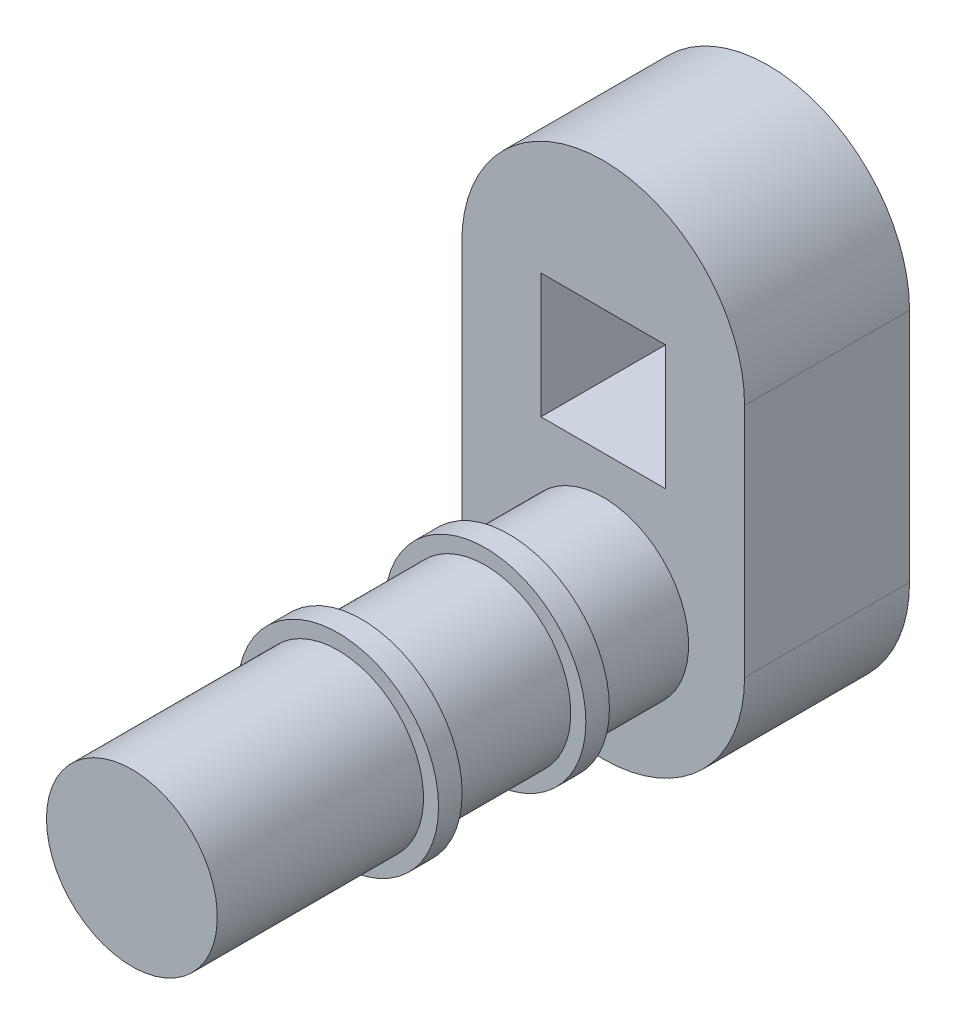
ISO-10303-21;
HEADER;
FILE_DESCRIPTION(('STEP AP214'),'2;1');
FILE_NAME('part.step','',(''),(''),'','','');
FILE_SCHEMA(('AUTOMOTIVE_DESIGN { 1 0 10303 214 1 1 1 1 }'));
ENDSEC;
DATA;
#1=APPLICATION_CONTEXT('core data for automotive mechanical design processes');
#2=APPLICATION_PROTOCOL_DEFINITION('international standard','automotive_design',2000,#1);
#3=PRODUCT_CONTEXT('',#1,'mechanical');
#4=PRODUCT('Part','Part','',(#3));
#5=PRODUCT_RELATED_PRODUCT_CATEGORY('part','',(#4));
#6=PRODUCT_DEFINITION_FORMATION('','',#4);
#7=PRODUCT_DEFINITION_CONTEXT('part definition',#1,'design');
#8=PRODUCT_DEFINITION('design','',#6,#7);
#9=PRODUCT_DEFINITION_SHAPE('','',#8);
#10=(LENGTH_UNIT() NAMED_UNIT(*) SI_UNIT(.MILLI.,.METRE.));
#11=(NAMED_UNIT(*) PLANE_ANGLE_UNIT() SI_UNIT($,.RADIAN.));
#12=(NAMED_UNIT(*) SI_UNIT($,.STERADIAN.) SOLID_ANGLE_UNIT());
#13=UNCERTAINTY_MEASURE_WITH_UNIT(LENGTH_MEASURE(1.E-05),#10,'distance_accuracy_value','');
#14=(GEOMETRIC_REPRESENTATION_CONTEXT(3) GLOBAL_UNCERTAINTY_ASSIGNED_CONTEXT((#13)) GLOBAL_UNIT_ASSIGNED_CONTEXT((#10,
#11,#12)) REPRESENTATION_CONTEXT('',''));
#15=CARTESIAN_POINT('',(0.,0.,0.));
#16=DIRECTION('',(0.,0.,1.));
#17=DIRECTION('',(1.,0.,0.));
#18=AXIS2_PLACEMENT_3D('',#15,#16,#17);
#19=CARTESIAN_POINT('',(0.,0.,7.));
#20=DIRECTION('',(0.,0.,1.));
#21=DIRECTION('',(1.,0.,0.));
#22=AXIS2_PLACEMENT_3D('',#19,#20,#21);
#23=PLANE('',#22);
#24=CARTESIAN_POINT('',(0.,-10.,7.));
#25=DIRECTION('',(0.,0.,-1.));
#26=DIRECTION('',(-1.,0.,0.));
#27=AXIS2_PLACEMENT_3D('',#24,#25,#26);
#28=CIRCLE('',#27,3.625);
#29=CARTESIAN_POINT('',(-3.625,-10.,7.));
#30=VERTEX_POINT('',#29);
#31=EDGE_CURVE('E130',#30,#30,#28,.T.);
#32=ORIENTED_EDGE('',*,*,#31,.T.);
#33=EDGE_LOOP('',(#32));
#34=FACE_BOUND('',#33,.T.);
#35=CARTESIAN_POINT('',(0.,0.,7.));
#36=DIRECTION('',(0.,0.,1.));
#37=DIRECTION('',(1.,0.,0.));
#38=AXIS2_PLACEMENT_3D('',#35,#36,#37);
#39=CIRCLE('',#38,6.);
#40=CARTESIAN_POINT('',(6.,0.,7.));
#41=VERTEX_POINT('',#40);
#42=CARTESIAN_POINT('',(-6.,0.,7.));
#43=VERTEX_POINT('',#42);
#44=EDGE_CURVE('E151',#41,#43,#39,.T.);
#45=ORIENTED_EDGE('',*,*,#44,.T.);
#46=DIRECTION('',(0.,-1.,0.));
#47=VECTOR('',#46,1.);
#48=CARTESIAN_POINT('',(-6.,0.,7.));
#49=LINE('',#48,#47);
#50=CARTESIAN_POINT('',(-6.,-10.,7.));
#51=VERTEX_POINT('',#50);
#52=EDGE_CURVE('E154',#43,#51,#49,.T.);
#53=ORIENTED_EDGE('',*,*,#52,.T.);
#54=CARTESIAN_POINT('',(0.,-10.,7.));
#55=DIRECTION('',(0.,0.,1.));
#56=DIRECTION('',(1.,0.,0.));
#57=AXIS2_PLACEMENT_3D('',#54,#55,#56);
#58=CIRCLE('',#57,6.);
#59=CARTESIAN_POINT('',(6.,-10.,7.));
#60=VERTEX_POINT('',#59);
#61=EDGE_CURVE('E157',#51,#60,#58,.T.);
#62=ORIENTED_EDGE('',*,*,#61,.T.);
#63=DIRECTION('',(0.,1.,0.));
#64=VECTOR('',#63,1.);
#65=CARTESIAN_POINT('',(6.,0.,7.));
#66=LINE('',#65,#64);
#67=EDGE_CURVE('E159',#60,#41,#66,.T.);
#68=ORIENTED_EDGE('',*,*,#67,.T.);
#69=EDGE_LOOP('',(#45,#53,#62,#68));
#70=FACE_BOUND('',#69,.T.);
#71=DIRECTION('',(-1.,0.,0.));
#72=VECTOR('',#71,1.);
#73=CARTESIAN_POINT('',(-2.644,0.544000000000001,7.));
#74=LINE('',#73,#72);
#75=CARTESIAN_POINT('',(2.644,0.544000000000001,7.));
#76=VERTEX_POINT('',#75);
#77=CARTESIAN_POINT('',(-2.644,0.544000000000001,7.));
#78=VERTEX_POINT('',#77);
#79=EDGE_CURVE('E129',#76,#78,#74,.T.);
#80=ORIENTED_EDGE('',*,*,#79,.F.);
#81=DIRECTION('',(0.,1.,0.));
#82=VECTOR('',#81,1.);
#83=CARTESIAN_POINT('',(2.644,-4.744,7.));
#84=LINE('',#83,#82);
#85=CARTESIAN_POINT('',(2.644,-4.744,7.));
#86=VERTEX_POINT('',#85);
#87=EDGE_CURVE('E119',#86,#76,#84,.T.);
#88=ORIENTED_EDGE('',*,*,#87,.F.);
#89=DIRECTION('',(1.,0.,0.));
#90=VECTOR('',#89,1.);
#91=CARTESIAN_POINT('',(-2.644,-4.744,7.));
#92=LINE('',#91,#90);
#93=CARTESIAN_POINT('',(-2.644,-4.744,7.));
#94=VERTEX_POINT('',#93);
#95=EDGE_CURVE('E142',#94,#86,#92,.T.);
#96=ORIENTED_EDGE('',*,*,#95,.F.);
#97=DIRECTION('',(0.,-1.,0.));
#98=VECTOR('',#97,1.);
#99=CARTESIAN_POINT('',(-2.644,-4.744,7.));
#100=LINE('',#99,#98);
#101=EDGE_CURVE('E140',#78,#94,#100,.T.);
#102=ORIENTED_EDGE('',*,*,#101,.F.);
#103=EDGE_LOOP('',(#80,#88,#96,#102));
#104=FACE_BOUND('',#103,.T.);
#105=ADVANCED_FACE('F39',(#34,#70,#104),#23,.T.);
#106=CARTESIAN_POINT('',(0.,0.,0.));
#107=DIRECTION('',(0.,0.,1.));
#108=DIRECTION('',(1.,0.,0.));
#109=AXIS2_PLACEMENT_3D('',#106,#107,#108);
#110=PLANE('',#109);
#111=DIRECTION('',(1.,0.,0.));
#112=VECTOR('',#111,1.);
#113=CARTESIAN_POINT('',(2.644,-5.744,0.));
#114=LINE('',#113,#112);
#115=CARTESIAN_POINT('',(-3.644,-5.744,0.));
#116=VERTEX_POINT('',#115);
#117=CARTESIAN_POINT('',(3.644,-5.744,0.));
#118=VERTEX_POINT('',#117);
#119=EDGE_CURVE('E184',#116,#118,#114,.T.);
#120=ORIENTED_EDGE('',*,*,#119,.T.);
#121=DIRECTION('',(0.,1.,0.));
#122=VECTOR('',#121,1.);
#123=CARTESIAN_POINT('',(3.644,0.544000000000001,0.));
#124=LINE('',#123,#122);
#125=CARTESIAN_POINT('',(3.644,1.544,0.));
#126=VERTEX_POINT('',#125);
#127=EDGE_CURVE('E186',#118,#126,#124,.T.);
#128=ORIENTED_EDGE('',*,*,#127,.T.);
#129=DIRECTION('',(-1.,0.,0.));
#130=VECTOR('',#129,1.);
#131=CARTESIAN_POINT('',(-2.644,1.544,0.));
#132=LINE('',#131,#130);
#133=CARTESIAN_POINT('',(-3.644,1.544,0.));
#134=VERTEX_POINT('',#133);
#135=EDGE_CURVE('E180',#126,#134,#132,.T.);
#136=ORIENTED_EDGE('',*,*,#135,.T.);
#137=DIRECTION('',(0.,-1.,0.));
#138=VECTOR('',#137,1.);
#139=CARTESIAN_POINT('',(-3.644,-4.744,0.));
#140=LINE('',#139,#138);
#141=EDGE_CURVE('E182',#134,#116,#140,.T.);
#142=ORIENTED_EDGE('',*,*,#141,.T.);
#143=EDGE_LOOP('',(#120,#128,#136,#142));
#144=FACE_BOUND('',#143,.T.);
#145=CARTESIAN_POINT('',(0.,0.,0.));
#146=DIRECTION('',(0.,0.,1.));
#147=DIRECTION('',(1.,0.,0.));
#148=AXIS2_PLACEMENT_3D('',#145,#146,#147);
#149=CIRCLE('',#148,6.);
#150=CARTESIAN_POINT('',(6.,0.,0.));
#151=VERTEX_POINT('',#150);
#152=CARTESIAN_POINT('',(-6.,0.,0.));
#153=VERTEX_POINT('',#152);
#154=EDGE_CURVE('E135',#151,#153,#149,.T.);
#155=ORIENTED_EDGE('',*,*,#154,.F.);
#156=DIRECTION('',(0.,1.,0.));
#157=VECTOR('',#156,1.);
#158=CARTESIAN_POINT('',(6.,0.,0.));
#159=LINE('',#158,#157);
#160=CARTESIAN_POINT('',(6.,-10.,0.));
#161=VERTEX_POINT('',#160);
#162=EDGE_CURVE('E155',#161,#151,#159,.T.);
#163=ORIENTED_EDGE('',*,*,#162,.F.);
#164=CARTESIAN_POINT('',(0.,-10.,0.));
#165=DIRECTION('',(0.,0.,1.));
#166=DIRECTION('',(1.,0.,0.));
#167=AXIS2_PLACEMENT_3D('',#164,#165,#166);
#168=CIRCLE('',#167,6.);
#169=CARTESIAN_POINT('',(-6.,-10.,0.));
#170=VERTEX_POINT('',#169);
#171=EDGE_CURVE('E166',#170,#161,#168,.T.);
#172=ORIENTED_EDGE('',*,*,#171,.F.);
#173=DIRECTION('',(0.,-1.,0.));
#174=VECTOR('',#173,1.);
#175=CARTESIAN_POINT('',(-6.,0.,0.));
#176=LINE('',#175,#174);
#177=EDGE_CURVE('E164',#153,#170,#176,.T.);
#178=ORIENTED_EDGE('',*,*,#177,.F.);
#179=EDGE_LOOP('',(#155,#163,#172,#178));
#180=FACE_BOUND('',#179,.T.);
#181=ADVANCED_FACE('F298',(#144,#180),#110,.F.);
#182=CARTESIAN_POINT('',(0.,0.,7.));
#183=DIRECTION('',(0.,0.,-1.));
#184=DIRECTION('',(-1.,0.,0.));
#185=AXIS2_PLACEMENT_3D('',#182,#183,#184);
#186=CYLINDRICAL_SURFACE('',#185,6.);
#187=ORIENTED_EDGE('',*,*,#154,.T.);
#188=DIRECTION('',(0.,0.,-1.));
#189=VECTOR('',#188,1.);
#190=CARTESIAN_POINT('',(-6.,0.,7.));
#191=LINE('',#190,#189);
#192=EDGE_CURVE('E177',#43,#153,#191,.T.);
#193=ORIENTED_EDGE('',*,*,#192,.F.);
#194=ORIENTED_EDGE('',*,*,#44,.F.);
#195=DIRECTION('',(0.,0.,-1.));
#196=VECTOR('',#195,1.);
#197=CARTESIAN_POINT('',(6.,0.,7.));
#198=LINE('',#197,#196);
#199=EDGE_CURVE('E161',#41,#151,#198,.T.);
#200=ORIENTED_EDGE('',*,*,#199,.T.);
#201=EDGE_LOOP('',(#187,#193,#194,#200));
#202=FACE_BOUND('',#201,.T.);
#203=ADVANCED_FACE('F304',(#202),#186,.T.);
#204=CARTESIAN_POINT('',(-6.,0.,7.));
#205=DIRECTION('',(1.,0.,0.));
#206=DIRECTION('',(0.,1.,0.));
#207=AXIS2_PLACEMENT_3D('',#204,#205,#206);
#208=PLANE('',#207);
#209=ORIENTED_EDGE('',*,*,#177,.T.);
#210=DIRECTION('',(0.,0.,-1.));
#211=VECTOR('',#210,1.);
#212=CARTESIAN_POINT('',(-6.,-10.,7.));
#213=LINE('',#212,#211);
#214=EDGE_CURVE('E174',#51,#170,#213,.T.);
#215=ORIENTED_EDGE('',*,*,#214,.F.);
#216=ORIENTED_EDGE('',*,*,#52,.F.);
#217=ORIENTED_EDGE('',*,*,#192,.T.);
#218=EDGE_LOOP('',(#209,#215,#216,#217));
#219=FACE_BOUND('',#218,.T.);
#220=ADVANCED_FACE('F316',(#219),#208,.F.);
#221=CARTESIAN_POINT('',(0.,-10.,7.));
#222=DIRECTION('',(0.,0.,-1.));
#223=DIRECTION('',(-1.,0.,0.));
#224=AXIS2_PLACEMENT_3D('',#221,#222,#223);
#225=CYLINDRICAL_SURFACE('',#224,6.);
#226=ORIENTED_EDGE('',*,*,#171,.T.);
#227=DIRECTION('',(0.,0.,-1.));
#228=VECTOR('',#227,1.);
#229=CARTESIAN_POINT('',(6.,-10.,7.));
#230=LINE('',#229,#228);
#231=EDGE_CURVE('E171',#60,#161,#230,.T.);
#232=ORIENTED_EDGE('',*,*,#231,.F.);
#233=ORIENTED_EDGE('',*,*,#61,.F.);
#234=ORIENTED_EDGE('',*,*,#214,.T.);
#235=EDGE_LOOP('',(#226,#232,#233,#234));
#236=FACE_BOUND('',#235,.T.);
#237=ADVANCED_FACE('F312',(#236),#225,.T.);
#238=CARTESIAN_POINT('',(6.,0.,7.));
#239=DIRECTION('',(-1.,0.,0.));
#240=DIRECTION('',(0.,0.,1.));
#241=AXIS2_PLACEMENT_3D('',#238,#239,#240);
#242=PLANE('',#241);
#243=ORIENTED_EDGE('',*,*,#162,.T.);
#244=ORIENTED_EDGE('',*,*,#199,.F.);
#245=ORIENTED_EDGE('',*,*,#67,.F.);
#246=ORIENTED_EDGE('',*,*,#231,.T.);
#247=EDGE_LOOP('',(#243,#244,#245,#246));
#248=FACE_BOUND('',#247,.T.);
#249=ADVANCED_FACE('F310',(#248),#242,.F.);
#250=CARTESIAN_POINT('',(2.644,-4.744,7.));
#251=DIRECTION('',(-1.,0.,0.));
#252=DIRECTION('',(0.,-1.,0.));
#253=AXIS2_PLACEMENT_3D('',#250,#251,#252);
#254=PLANE('',#253);
#255=DIRECTION('',(0.,0.,-1.));
#256=VECTOR('',#255,1.);
#257=CARTESIAN_POINT('',(2.644,0.544000000000001,7.));
#258=LINE('',#257,#256);
#259=CARTESIAN_POINT('',(2.644,0.544000000000001,1.));
#260=VERTEX_POINT('',#259);
#261=EDGE_CURVE('E123',#76,#260,#258,.T.);
#262=ORIENTED_EDGE('',*,*,#261,.T.);
#263=DIRECTION('',(0.,1.,0.));
#264=VECTOR('',#263,1.);
#265=CARTESIAN_POINT('',(2.644,-4.744,1.));
#266=LINE('',#265,#264);
#267=CARTESIAN_POINT('',(2.644,-4.744,1.));
#268=VERTEX_POINT('',#267);
#269=EDGE_CURVE('E189',#260,#268,#266,.F.);
#270=ORIENTED_EDGE('',*,*,#269,.T.);
#271=DIRECTION('',(0.,0.,-1.));
#272=VECTOR('',#271,1.);
#273=CARTESIAN_POINT('',(2.644,-4.744,7.));
#274=LINE('',#273,#272);
#275=EDGE_CURVE('E125',#86,#268,#274,.T.);
#276=ORIENTED_EDGE('',*,*,#275,.F.);
#277=ORIENTED_EDGE('',*,*,#87,.T.);
#278=EDGE_LOOP('',(#262,#270,#276,#277));
#279=FACE_BOUND('',#278,.T.);
#280=ADVANCED_FACE('F121',(#279),#254,.T.);
#281=CARTESIAN_POINT('',(-2.644,0.544000000000001,7.));
#282=DIRECTION('',(0.,-1.,0.));
#283=DIRECTION('',(0.,0.,-1.));
#284=AXIS2_PLACEMENT_3D('',#281,#282,#283);
#285=PLANE('',#284);
#286=DIRECTION('',(0.,0.,-1.));
#287=VECTOR('',#286,1.);
#288=CARTESIAN_POINT('',(-2.644,0.544000000000001,7.));
#289=LINE('',#288,#287);
#290=CARTESIAN_POINT('',(-2.644,0.544000000000001,1.));
#291=VERTEX_POINT('',#290);
#292=EDGE_CURVE('E136',#78,#291,#289,.T.);
#293=ORIENTED_EDGE('',*,*,#292,.T.);
#294=DIRECTION('',(-1.,0.,0.));
#295=VECTOR('',#294,1.);
#296=CARTESIAN_POINT('',(2.644,0.544000000000001,1.));
#297=LINE('',#296,#295);
#298=EDGE_CURVE('E11',#291,#260,#297,.F.);
#299=ORIENTED_EDGE('',*,*,#298,.T.);
#300=ORIENTED_EDGE('',*,*,#261,.F.);
#301=ORIENTED_EDGE('',*,*,#79,.T.);
#302=EDGE_LOOP('',(#293,#299,#300,#301));
#303=FACE_BOUND('',#302,.T.);
#304=ADVANCED_FACE('F133',(#303),#285,.T.);
#305=CARTESIAN_POINT('',(-2.644,-4.744,7.));
#306=DIRECTION('',(1.,0.,0.));
#307=DIRECTION('',(0.,0.,-1.));
#308=AXIS2_PLACEMENT_3D('',#305,#306,#307);
#309=PLANE('',#308);
#310=DIRECTION('',(0.,0.,-1.));
#311=VECTOR('',#310,1.);
#312=CARTESIAN_POINT('',(-2.644,-4.744,7.));
#313=LINE('',#312,#311);
#314=CARTESIAN_POINT('',(-2.644,-4.744,1.));
#315=VERTEX_POINT('',#314);
#316=EDGE_CURVE('E148',#94,#315,#313,.T.);
#317=ORIENTED_EDGE('',*,*,#316,.T.);
#318=DIRECTION('',(0.,-1.,0.));
#319=VECTOR('',#318,1.);
#320=CARTESIAN_POINT('',(-2.644,0.544000000000001,1.));
#321=LINE('',#320,#319);
#322=EDGE_CURVE('E48',#315,#291,#321,.F.);
#323=ORIENTED_EDGE('',*,*,#322,.T.);
#324=ORIENTED_EDGE('',*,*,#292,.F.);
#325=ORIENTED_EDGE('',*,*,#101,.T.);
#326=EDGE_LOOP('',(#317,#323,#324,#325));
#327=FACE_BOUND('',#326,.T.);
#328=ADVANCED_FACE('F343',(#327),#309,.T.);
#329=CARTESIAN_POINT('',(-2.644,-4.744,7.));
#330=DIRECTION('',(0.,1.,0.));
#331=DIRECTION('',(0.,0.,1.));
#332=AXIS2_PLACEMENT_3D('',#329,#330,#331);
#333=PLANE('',#332);
#334=ORIENTED_EDGE('',*,*,#275,.T.);
#335=DIRECTION('',(1.,0.,0.));
#336=VECTOR('',#335,1.);
#337=CARTESIAN_POINT('',(-2.644,-4.744,1.));
#338=LINE('',#337,#336);
#339=EDGE_CURVE('E63',#268,#315,#338,.F.);
#340=ORIENTED_EDGE('',*,*,#339,.T.);
#341=ORIENTED_EDGE('',*,*,#316,.F.);
#342=ORIENTED_EDGE('',*,*,#95,.T.);
#343=EDGE_LOOP('',(#334,#340,#341,#342));
#344=FACE_BOUND('',#343,.T.);
#345=ADVANCED_FACE('F243',(#344),#333,.T.);
#346=CARTESIAN_POINT('',(0.,-10.,7.));
#347=DIRECTION('',(0.,0.,-1.));
#348=DIRECTION('',(-1.,0.,0.));
#349=AXIS2_PLACEMENT_3D('',#346,#347,#348);
#350=CYLINDRICAL_SURFACE('',#349,3.625);
#351=ORIENTED_EDGE('',*,*,#31,.F.);
#352=EDGE_LOOP('',(#351));
#353=FACE_BOUND('',#352,.T.);
#354=CARTESIAN_POINT('',(0.,-10.,11.));
#355=DIRECTION('',(0.,0.,-1.));
#356=DIRECTION('',(-1.,0.,0.));
#357=AXIS2_PLACEMENT_3D('',#354,#355,#356);
#358=CIRCLE('',#357,3.625);
#359=CARTESIAN_POINT('',(-3.625,-10.,11.));
#360=VERTEX_POINT('',#359);
#361=EDGE_CURVE('E232',#360,#360,#358,.T.);
#362=ORIENTED_EDGE('',*,*,#361,.T.);
#363=EDGE_LOOP('',(#362));
#364=FACE_BOUND('',#363,.T.);
#365=ADVANCED_FACE('F239',(#353,#364),#350,.T.);
#366=CARTESIAN_POINT('',(0.,-14.2645108906658,11.));
#367=DIRECTION('',(0.,0.,1.));
#368=DIRECTION('',(1.,0.,0.));
#369=AXIS2_PLACEMENT_3D('',#366,#367,#368);
#370=PLANE('',#369);
#371=ORIENTED_EDGE('',*,*,#361,.F.);
#372=EDGE_LOOP('',(#371));
#373=FACE_BOUND('',#372,.T.);
#374=CARTESIAN_POINT('',(0.,-10.,11.));
#375=DIRECTION('',(0.,0.,-1.));
#376=DIRECTION('',(-1.,0.,0.));
#377=AXIS2_PLACEMENT_3D('',#374,#375,#376);
#378=CIRCLE('',#377,4.26451089066583);
#379=CARTESIAN_POINT('',(-4.26451089066583,-10.,11.));
#380=VERTEX_POINT('',#379);
#381=EDGE_CURVE('E229',#380,#380,#378,.T.);
#382=ORIENTED_EDGE('',*,*,#381,.T.);
#383=EDGE_LOOP('',(#382));
#384=FACE_BOUND('',#383,.T.);
#385=ADVANCED_FACE('F242',(#373,#384),#370,.F.);
#386=CARTESIAN_POINT('',(0.,-10.,7.));
#387=DIRECTION('',(0.,0.,-1.));
#388=DIRECTION('',(-1.,0.,0.));
#389=AXIS2_PLACEMENT_3D('',#386,#387,#388);
#390=CYLINDRICAL_SURFACE('',#389,4.26451089066583);
#391=ORIENTED_EDGE('',*,*,#381,.F.);
#392=EDGE_LOOP('',(#391));
#393=FACE_BOUND('',#392,.T.);
#394=CARTESIAN_POINT('',(0.,-10.,12.));
#395=DIRECTION('',(0.,0.,-1.));
#396=DIRECTION('',(-1.,0.,0.));
#397=AXIS2_PLACEMENT_3D('',#394,#395,#396);
#398=CIRCLE('',#397,4.26451089066583);
#399=CARTESIAN_POINT('',(-4.26451089066583,-10.,12.));
#400=VERTEX_POINT('',#399);
#401=EDGE_CURVE('E226',#400,#400,#398,.T.);
#402=ORIENTED_EDGE('',*,*,#401,.T.);
#403=EDGE_LOOP('',(#402));
#404=FACE_BOUND('',#403,.T.);
#405=ADVANCED_FACE('F249',(#393,#404),#390,.T.);
#406=CARTESIAN_POINT('',(0.,-13.625,12.));
#407=DIRECTION('',(0.,0.,-1.));
#408=DIRECTION('',(-1.,0.,0.));
#409=AXIS2_PLACEMENT_3D('',#406,#407,#408);
#410=PLANE('',#409);
#411=ORIENTED_EDGE('',*,*,#401,.F.);
#412=EDGE_LOOP('',(#411));
#413=FACE_BOUND('',#412,.T.);
#414=CARTESIAN_POINT('',(0.,-10.,12.));
#415=DIRECTION('',(0.,0.,-1.));
#416=DIRECTION('',(-1.,0.,0.));
#417=AXIS2_PLACEMENT_3D('',#414,#415,#416);
#418=CIRCLE('',#417,3.625);
#419=CARTESIAN_POINT('',(-3.625,-10.,12.));
#420=VERTEX_POINT('',#419);
#421=EDGE_CURVE('E223',#420,#420,#418,.T.);
#422=ORIENTED_EDGE('',*,*,#421,.T.);
#423=EDGE_LOOP('',(#422));
#424=FACE_BOUND('',#423,.T.);
#425=ADVANCED_FACE('F255',(#413,#424),#410,.F.);
#426=CARTESIAN_POINT('',(0.,-10.,7.));
#427=DIRECTION('',(0.,0.,-1.));
#428=DIRECTION('',(-1.,0.,0.));
#429=AXIS2_PLACEMENT_3D('',#426,#427,#428);
#430=CYLINDRICAL_SURFACE('',#429,3.625);
#431=ORIENTED_EDGE('',*,*,#421,.F.);
#432=EDGE_LOOP('',(#431));
#433=FACE_BOUND('',#432,.T.);
#434=CARTESIAN_POINT('',(0.,-10.,17.25));
#435=DIRECTION('',(0.,0.,-1.));
#436=DIRECTION('',(-1.,0.,0.));
#437=AXIS2_PLACEMENT_3D('',#434,#435,#436);
#438=CIRCLE('',#437,3.625);
#439=CARTESIAN_POINT('',(-3.625,-10.,17.25));
#440=VERTEX_POINT('',#439);
#441=EDGE_CURVE('E220',#440,#440,#438,.T.);
#442=ORIENTED_EDGE('',*,*,#441,.T.);
#443=EDGE_LOOP('',(#442));
#444=FACE_BOUND('',#443,.T.);
#445=ADVANCED_FACE('F261',(#433,#444),#430,.T.);
#446=CARTESIAN_POINT('',(0.,-14.2645108906658,17.25));
#447=DIRECTION('',(0.,0.,1.));
#448=DIRECTION('',(1.,0.,0.));
#449=AXIS2_PLACEMENT_3D('',#446,#447,#448);
#450=PLANE('',#449);
#451=ORIENTED_EDGE('',*,*,#441,.F.);
#452=EDGE_LOOP('',(#451));
#453=FACE_BOUND('',#452,.T.);
#454=CARTESIAN_POINT('',(0.,-10.,17.25));
#455=DIRECTION('',(0.,0.,-1.));
#456=DIRECTION('',(-1.,0.,0.));
#457=AXIS2_PLACEMENT_3D('',#454,#455,#456);
#458=CIRCLE('',#457,4.26451089066583);
#459=CARTESIAN_POINT('',(-4.26451089066583,-10.,17.25));
#460=VERTEX_POINT('',#459);
#461=EDGE_CURVE('E217',#460,#460,#458,.T.);
#462=ORIENTED_EDGE('',*,*,#461,.T.);
#463=EDGE_LOOP('',(#462));
#464=FACE_BOUND('',#463,.T.);
#465=ADVANCED_FACE('F267',(#453,#464),#450,.F.);
#466=CARTESIAN_POINT('',(0.,-10.,7.));
#467=DIRECTION('',(0.,0.,-1.));
#468=DIRECTION('',(-1.,0.,0.));
#469=AXIS2_PLACEMENT_3D('',#466,#467,#468);
#470=CYLINDRICAL_SURFACE('',#469,4.26451089066583);
#471=ORIENTED_EDGE('',*,*,#461,.F.);
#472=EDGE_LOOP('',(#471));
#473=FACE_BOUND('',#472,.T.);
#474=CARTESIAN_POINT('',(0.,-10.,18.25));
#475=DIRECTION('',(0.,0.,-1.));
#476=DIRECTION('',(-1.,0.,0.));
#477=AXIS2_PLACEMENT_3D('',#474,#475,#476);
#478=CIRCLE('',#477,4.26451089066583);
#479=CARTESIAN_POINT('',(-4.26451089066583,-10.,18.25));
#480=VERTEX_POINT('',#479);
#481=EDGE_CURVE('E212',#480,#480,#478,.T.);
#482=ORIENTED_EDGE('',*,*,#481,.T.);
#483=EDGE_LOOP('',(#482));
#484=FACE_BOUND('',#483,.T.);
#485=ADVANCED_FACE('F273',(#473,#484),#470,.T.);
#486=CARTESIAN_POINT('',(0.,-13.625,18.25));
#487=DIRECTION('',(0.,0.,-1.));
#488=DIRECTION('',(-1.,0.,0.));
#489=AXIS2_PLACEMENT_3D('',#486,#487,#488);
#490=PLANE('',#489);
#491=ORIENTED_EDGE('',*,*,#481,.F.);
#492=EDGE_LOOP('',(#491));
#493=FACE_BOUND('',#492,.T.);
#494=CARTESIAN_POINT('',(0.,-10.,18.25));
#495=DIRECTION('',(0.,0.,-1.));
#496=DIRECTION('',(-1.,0.,0.));
#497=AXIS2_PLACEMENT_3D('',#494,#495,#496);
#498=CIRCLE('',#497,3.625);
#499=CARTESIAN_POINT('',(-3.625,-10.,18.25));
#500=VERTEX_POINT('',#499);
#501=EDGE_CURVE('E207',#500,#500,#498,.T.);
#502=ORIENTED_EDGE('',*,*,#501,.T.);
#503=EDGE_LOOP('',(#502));
#504=FACE_BOUND('',#503,.T.);
#505=ADVANCED_FACE('F279',(#493,#504),#490,.F.);
#506=CARTESIAN_POINT('',(0.,-10.,7.));
#507=DIRECTION('',(0.,0.,-1.));
#508=DIRECTION('',(-1.,0.,0.));
#509=AXIS2_PLACEMENT_3D('',#506,#507,#508);
#510=CYLINDRICAL_SURFACE('',#509,3.625);
#511=ORIENTED_EDGE('',*,*,#501,.F.);
#512=EDGE_LOOP('',(#511));
#513=FACE_BOUND('',#512,.T.);
#514=CARTESIAN_POINT('',(0.,-10.,27.));
#515=DIRECTION('',(0.,0.,-1.));
#516=DIRECTION('',(-1.,0.,0.));
#517=AXIS2_PLACEMENT_3D('',#514,#515,#516);
#518=CIRCLE('',#517,3.625);
#519=CARTESIAN_POINT('',(-3.625,-10.,27.));
#520=VERTEX_POINT('',#519);
#521=EDGE_CURVE('E202',#520,#520,#518,.T.);
#522=ORIENTED_EDGE('',*,*,#521,.T.);
#523=EDGE_LOOP('',(#522));
#524=FACE_BOUND('',#523,.T.);
#525=ADVANCED_FACE('F285',(#513,#524),#510,.T.);
#526=CARTESIAN_POINT('',(0.,-13.625,27.));
#527=DIRECTION('',(0.,0.,-1.));
#528=DIRECTION('',(-1.,0.,0.));
#529=AXIS2_PLACEMENT_3D('',#526,#527,#528);
#530=PLANE('',#529);
#531=ORIENTED_EDGE('',*,*,#521,.F.);
#532=EDGE_LOOP('',(#531));
#533=FACE_BOUND('',#532,.T.);
#534=ADVANCED_FACE('F290',(#533),#530,.F.);
#535=CARTESIAN_POINT('',(-3.644,0.,1.));
#536=DIRECTION('',(0.,1.,0.));
#537=DIRECTION('',(0.,0.,1.));
#538=AXIS2_PLACEMENT_3D('',#535,#536,#537);
#539=CYLINDRICAL_SURFACE('',#538,1.);
#540=CARTESIAN_POINT('',(-3.644,1.544,1.));
#541=DIRECTION('',(0.707106781186547,0.707106781186547,0.));
#542=DIRECTION('',(-0.707106781186547,0.707106781186547,0.));
#543=AXIS2_PLACEMENT_3D('',#540,#541,#542);
#544=ELLIPSE('',#543,1.41421356237309,1.);
#545=EDGE_CURVE('E196',#291,#134,#544,.T.);
#546=ORIENTED_EDGE('',*,*,#545,.F.);
#547=ORIENTED_EDGE('',*,*,#322,.F.);
#548=CARTESIAN_POINT('',(-3.644,-5.744,1.));
#549=DIRECTION('',(-0.707106781186547,0.707106781186547,0.));
#550=DIRECTION('',(-0.707106781186547,-0.707106781186547,0.));
#551=AXIS2_PLACEMENT_3D('',#548,#549,#550);
#552=ELLIPSE('',#551,1.41421356237309,1.);
#553=EDGE_CURVE('E43',#116,#315,#552,.F.);
#554=ORIENTED_EDGE('',*,*,#553,.F.);
#555=ORIENTED_EDGE('',*,*,#141,.F.);
#556=EDGE_LOOP('',(#546,#547,#554,#555));
#557=FACE_BOUND('',#556,.T.);
#558=ADVANCED_FACE('F41',(#557),#539,.T.);
#559=CARTESIAN_POINT('',(0.,-5.744,1.));
#560=DIRECTION('',(-1.,0.,0.));
#561=DIRECTION('',(0.,0.,1.));
#562=AXIS2_PLACEMENT_3D('',#559,#560,#561);
#563=CYLINDRICAL_SURFACE('',#562,1.);
#564=ORIENTED_EDGE('',*,*,#553,.T.);
#565=ORIENTED_EDGE('',*,*,#339,.F.);
#566=CARTESIAN_POINT('',(3.644,-5.744,1.));
#567=DIRECTION('',(-0.707106781186547,-0.707106781186548,0.));
#568=DIRECTION('',(0.707106781186548,-0.707106781186547,0.));
#569=AXIS2_PLACEMENT_3D('',#566,#567,#568);
#570=ELLIPSE('',#569,1.4142135623731,1.);
#571=EDGE_CURVE('E195',#118,#268,#570,.F.);
#572=ORIENTED_EDGE('',*,*,#571,.F.);
#573=ORIENTED_EDGE('',*,*,#119,.F.);
#574=EDGE_LOOP('',(#564,#565,#572,#573));
#575=FACE_BOUND('',#574,.T.);
#576=ADVANCED_FACE('F330',(#575),#563,.T.);
#577=CARTESIAN_POINT('',(0.,1.544,1.));
#578=DIRECTION('',(1.,0.,0.));
#579=DIRECTION('',(0.,0.,-1.));
#580=AXIS2_PLACEMENT_3D('',#577,#578,#579);
#581=CYLINDRICAL_SURFACE('',#580,1.);
#582=ORIENTED_EDGE('',*,*,#545,.T.);
#583=ORIENTED_EDGE('',*,*,#135,.F.);
#584=CARTESIAN_POINT('',(3.644,1.544,1.));
#585=DIRECTION('',(0.707106781186548,-0.707106781186547,0.));
#586=DIRECTION('',(-0.707106781186547,-0.707106781186548,0.));
#587=AXIS2_PLACEMENT_3D('',#584,#585,#586);
#588=ELLIPSE('',#587,1.41421356237309,1.);
#589=EDGE_CURVE('E193',#260,#126,#588,.T.);
#590=ORIENTED_EDGE('',*,*,#589,.F.);
#591=ORIENTED_EDGE('',*,*,#298,.F.);
#592=EDGE_LOOP('',(#582,#583,#590,#591));
#593=FACE_BOUND('',#592,.T.);
#594=ADVANCED_FACE('F327',(#593),#581,.T.);
#595=CARTESIAN_POINT('',(3.644,0.,1.));
#596=DIRECTION('',(0.,-1.,0.));
#597=DIRECTION('',(1.,0.,0.));
#598=AXIS2_PLACEMENT_3D('',#595,#596,#597);
#599=CYLINDRICAL_SURFACE('',#598,1.);
#600=ORIENTED_EDGE('',*,*,#571,.T.);
#601=ORIENTED_EDGE('',*,*,#269,.F.);
#602=ORIENTED_EDGE('',*,*,#589,.T.);
#603=ORIENTED_EDGE('',*,*,#127,.F.);
#604=EDGE_LOOP('',(#600,#601,#602,#603));
#605=FACE_BOUND('',#604,.T.);
#606=ADVANCED_FACE('F324',(#605),#599,.T.);
#607=CLOSED_SHELL('',(#105,#181,#203,#220,#237,#249,#280,#304,#328,#345,#365,#385,#405,#425,
#445,#465,#485,#505,#525,#534,#558,#576,#594,#606));
#608=MANIFOLD_SOLID_BREP('B2',#607);
#609=ADVANCED_BREP_SHAPE_REPRESENTATION('',(#18,#608),#14);
#610=SHAPE_DEFINITION_REPRESENTATION(#9,#609);
ENDSEC;
END-ISO-10303-21;
